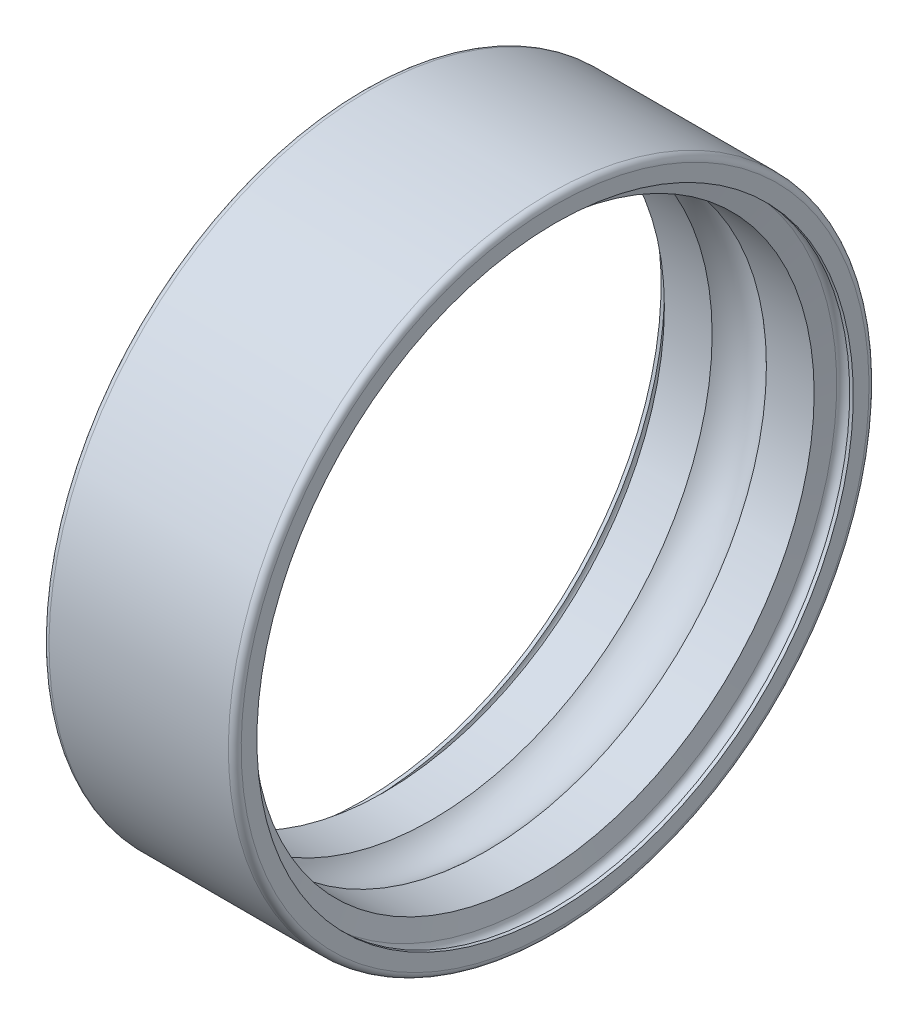
ISO-10303-21;
HEADER;
FILE_DESCRIPTION(('STEP AP214'),'2;1');
FILE_NAME('part.step','',(''),(''),'','','');
FILE_SCHEMA(('AUTOMOTIVE_DESIGN { 1 0 10303 214 1 1 1 1 }'));
ENDSEC;
DATA;
#1=APPLICATION_CONTEXT('core data for automotive mechanical design processes');
#2=APPLICATION_PROTOCOL_DEFINITION('international standard','automotive_design',2000,#1);
#3=PRODUCT_CONTEXT('',#1,'mechanical');
#4=PRODUCT('Part','Part','',(#3));
#5=PRODUCT_RELATED_PRODUCT_CATEGORY('part','',(#4));
#6=PRODUCT_DEFINITION_FORMATION('','',#4);
#7=PRODUCT_DEFINITION_CONTEXT('part definition',#1,'design');
#8=PRODUCT_DEFINITION('design','',#6,#7);
#9=PRODUCT_DEFINITION_SHAPE('','',#8);
#10=(LENGTH_UNIT() NAMED_UNIT(*) SI_UNIT(.MILLI.,.METRE.));
#11=(NAMED_UNIT(*) PLANE_ANGLE_UNIT() SI_UNIT($,.RADIAN.));
#12=(NAMED_UNIT(*) SI_UNIT($,.STERADIAN.) SOLID_ANGLE_UNIT());
#13=UNCERTAINTY_MEASURE_WITH_UNIT(LENGTH_MEASURE(1.E-05),#10,'distance_accuracy_value','');
#14=(GEOMETRIC_REPRESENTATION_CONTEXT(3) GLOBAL_UNCERTAINTY_ASSIGNED_CONTEXT((#13)) GLOBAL_UNIT_ASSIGNED_CONTEXT((#10,
#11,#12)) REPRESENTATION_CONTEXT('',''));
#15=CARTESIAN_POINT('',(0.,0.,0.));
#16=DIRECTION('',(0.,0.,1.));
#17=DIRECTION('',(1.,0.,0.));
#18=AXIS2_PLACEMENT_3D('',#15,#16,#17);
#19=CARTESIAN_POINT('',(2.832,0.,0.));
#20=DIRECTION('',(1.,0.,0.));
#21=DIRECTION('',(0.,0.,-1.));
#22=AXIS2_PLACEMENT_3D('',#19,#20,#21);
#23=TOROIDAL_SURFACE('',#22,4.655,0.112);
#24=CARTESIAN_POINT('',(2.944,0.,0.));
#25=DIRECTION('',(1.,0.,0.));
#26=DIRECTION('',(0.,1.,0.));
#27=AXIS2_PLACEMENT_3D('',#24,#25,#26);
#28=CIRCLE('',#27,4.655);
#29=CARTESIAN_POINT('',(2.944,4.655,0.));
#30=VERTEX_POINT('',#29);
#31=EDGE_CURVE('E11',#30,#30,#28,.T.);
#32=ORIENTED_EDGE('',*,*,#31,.T.);
#33=EDGE_LOOP('',(#32));
#34=FACE_BOUND('',#33,.T.);
#35=CARTESIAN_POINT('',(2.72170153166263,0.,0.));
#36=DIRECTION('',(1.,0.,0.));
#37=DIRECTION('',(0.,1.,0.));
#38=AXIS2_PLACEMENT_3D('',#35,#36,#37);
#39=CIRCLE('',#38,4.6744485958987);
#40=CARTESIAN_POINT('',(2.72170153166263,4.6744485958987,0.));
#41=VERTEX_POINT('',#40);
#42=EDGE_CURVE('E72',#41,#41,#39,.T.);
#43=ORIENTED_EDGE('',*,*,#42,.F.);
#44=EDGE_LOOP('',(#43));
#45=FACE_BOUND('',#44,.T.);
#46=ADVANCED_FACE('F16',(#34,#45),#23,.F.);
#47=CARTESIAN_POINT('',(2.972,0.,0.));
#48=DIRECTION('',(-1.,0.,0.));
#49=DIRECTION('',(0.,1.,0.));
#50=AXIS2_PLACEMENT_3D('',#47,#48,#49);
#51=CYLINDRICAL_SURFACE('',#50,4.655);
#52=CARTESIAN_POINT('',(3.,0.,0.));
#53=DIRECTION('',(1.,0.,0.));
#54=DIRECTION('',(0.,1.,0.));
#55=AXIS2_PLACEMENT_3D('',#52,#53,#54);
#56=CIRCLE('',#55,4.655);
#57=CARTESIAN_POINT('',(3.,4.655,0.));
#58=VERTEX_POINT('',#57);
#59=EDGE_CURVE('E26',#58,#58,#56,.T.);
#60=ORIENTED_EDGE('',*,*,#59,.T.);
#61=EDGE_LOOP('',(#60));
#62=FACE_BOUND('',#61,.T.);
#63=ORIENTED_EDGE('',*,*,#31,.F.);
#64=EDGE_LOOP('',(#63));
#65=FACE_BOUND('',#64,.T.);
#66=ADVANCED_FACE('F124',(#62,#65),#51,.F.);
#67=CARTESIAN_POINT('',(3.,4.7775,0.));
#68=DIRECTION('',(1.,0.,0.));
#69=DIRECTION('',(0.,1.,0.));
#70=AXIS2_PLACEMENT_3D('',#67,#68,#69);
#71=PLANE('',#70);
#72=CARTESIAN_POINT('',(3.,0.,0.));
#73=DIRECTION('',(1.,0.,0.));
#74=DIRECTION('',(0.,1.,0.));
#75=AXIS2_PLACEMENT_3D('',#72,#73,#74);
#76=CIRCLE('',#75,4.9);
#77=CARTESIAN_POINT('',(3.,4.9,0.));
#78=VERTEX_POINT('',#77);
#79=EDGE_CURVE('E62',#78,#78,#76,.T.);
#80=ORIENTED_EDGE('',*,*,#79,.T.);
#81=EDGE_LOOP('',(#80));
#82=FACE_BOUND('',#81,.T.);
#83=ORIENTED_EDGE('',*,*,#59,.F.);
#84=EDGE_LOOP('',(#83));
#85=FACE_BOUND('',#84,.T.);
#86=ADVANCED_FACE('F129',(#82,#85),#71,.T.);
#87=CARTESIAN_POINT('',(2.9,0.,0.));
#88=DIRECTION('',(1.,0.,0.));
#89=DIRECTION('',(0.,0.,-1.));
#90=AXIS2_PLACEMENT_3D('',#87,#88,#89);
#91=TOROIDAL_SURFACE('',#90,4.9,0.1);
#92=CARTESIAN_POINT('',(2.9,0.,0.));
#93=DIRECTION('',(1.,0.,0.));
#94=DIRECTION('',(0.,1.,0.));
#95=AXIS2_PLACEMENT_3D('',#92,#93,#94);
#96=CIRCLE('',#95,5.);
#97=CARTESIAN_POINT('',(2.9,5.,0.));
#98=VERTEX_POINT('',#97);
#99=EDGE_CURVE('E57',#98,#98,#96,.T.);
#100=ORIENTED_EDGE('',*,*,#99,.T.);
#101=EDGE_LOOP('',(#100));
#102=FACE_BOUND('',#101,.T.);
#103=ORIENTED_EDGE('',*,*,#79,.F.);
#104=EDGE_LOOP('',(#103));
#105=FACE_BOUND('',#104,.T.);
#106=ADVANCED_FACE('F140',(#102,#105),#91,.T.);
#107=CARTESIAN_POINT('',(1.5,0.,0.));
#108=DIRECTION('',(-1.,0.,0.));
#109=DIRECTION('',(0.,1.,0.));
#110=AXIS2_PLACEMENT_3D('',#107,#108,#109);
#111=CYLINDRICAL_SURFACE('',#110,5.);
#112=CARTESIAN_POINT('',(0.1,0.,0.));
#113=DIRECTION('',(1.,0.,0.));
#114=DIRECTION('',(0.,1.,0.));
#115=AXIS2_PLACEMENT_3D('',#112,#113,#114);
#116=CIRCLE('',#115,5.);
#117=CARTESIAN_POINT('',(0.1,5.,0.));
#118=VERTEX_POINT('',#117);
#119=EDGE_CURVE('E82',#118,#118,#116,.T.);
#120=ORIENTED_EDGE('',*,*,#119,.T.);
#121=EDGE_LOOP('',(#120));
#122=FACE_BOUND('',#121,.T.);
#123=ORIENTED_EDGE('',*,*,#99,.F.);
#124=EDGE_LOOP('',(#123));
#125=FACE_BOUND('',#124,.T.);
#126=ADVANCED_FACE('F144',(#122,#125),#111,.T.);
#127=CARTESIAN_POINT('',(0.1,0.,0.));
#128=DIRECTION('',(1.,0.,0.));
#129=DIRECTION('',(0.,0.,-1.));
#130=AXIS2_PLACEMENT_3D('',#127,#128,#129);
#131=TOROIDAL_SURFACE('',#130,4.9,0.1);
#132=CARTESIAN_POINT('',(0.,0.,0.));
#133=DIRECTION('',(1.,0.,0.));
#134=DIRECTION('',(0.,1.,0.));
#135=AXIS2_PLACEMENT_3D('',#132,#133,#134);
#136=CIRCLE('',#135,4.9);
#137=CARTESIAN_POINT('',(0.,4.9,0.));
#138=VERTEX_POINT('',#137);
#139=EDGE_CURVE('E87',#138,#138,#136,.T.);
#140=ORIENTED_EDGE('',*,*,#139,.T.);
#141=EDGE_LOOP('',(#140));
#142=FACE_BOUND('',#141,.T.);
#143=ORIENTED_EDGE('',*,*,#119,.F.);
#144=EDGE_LOOP('',(#143));
#145=FACE_BOUND('',#144,.T.);
#146=ADVANCED_FACE('F18',(#142,#145),#131,.T.);
#147=CARTESIAN_POINT('',(0.,4.7775,0.));
#148=DIRECTION('',(-1.,0.,0.));
#149=DIRECTION('',(0.,-1.,0.));
#150=AXIS2_PLACEMENT_3D('',#147,#148,#149);
#151=PLANE('',#150);
#152=CARTESIAN_POINT('',(0.,0.,0.));
#153=DIRECTION('',(1.,0.,0.));
#154=DIRECTION('',(0.,1.,0.));
#155=AXIS2_PLACEMENT_3D('',#152,#153,#154);
#156=CIRCLE('',#155,4.655);
#157=CARTESIAN_POINT('',(0.,4.655,0.));
#158=VERTEX_POINT('',#157);
#159=EDGE_CURVE('E20',#158,#158,#156,.T.);
#160=ORIENTED_EDGE('',*,*,#159,.T.);
#161=EDGE_LOOP('',(#160));
#162=FACE_BOUND('',#161,.T.);
#163=ORIENTED_EDGE('',*,*,#139,.F.);
#164=EDGE_LOOP('',(#163));
#165=FACE_BOUND('',#164,.T.);
#166=ADVANCED_FACE('F134',(#162,#165),#151,.T.);
#167=CARTESIAN_POINT('',(0.028,0.,0.));
#168=DIRECTION('',(-1.,0.,0.));
#169=DIRECTION('',(0.,1.,0.));
#170=AXIS2_PLACEMENT_3D('',#167,#168,#169);
#171=CYLINDRICAL_SURFACE('',#170,4.655);
#172=CARTESIAN_POINT('',(0.056,0.,0.));
#173=DIRECTION('',(1.,0.,0.));
#174=DIRECTION('',(0.,1.,0.));
#175=AXIS2_PLACEMENT_3D('',#172,#173,#174);
#176=CIRCLE('',#175,4.655);
#177=CARTESIAN_POINT('',(0.056,4.655,0.));
#178=VERTEX_POINT('',#177);
#179=EDGE_CURVE('E94',#178,#178,#176,.T.);
#180=ORIENTED_EDGE('',*,*,#179,.T.);
#181=EDGE_LOOP('',(#180));
#182=FACE_BOUND('',#181,.T.);
#183=ORIENTED_EDGE('',*,*,#159,.F.);
#184=EDGE_LOOP('',(#183));
#185=FACE_BOUND('',#184,.T.);
#186=ADVANCED_FACE('F119',(#182,#185),#171,.F.);
#187=CARTESIAN_POINT('',(0.168,0.,0.));
#188=DIRECTION('',(1.,0.,0.));
#189=DIRECTION('',(0.,0.,-1.));
#190=AXIS2_PLACEMENT_3D('',#187,#188,#189);
#191=TOROIDAL_SURFACE('',#190,4.655,0.112);
#192=CARTESIAN_POINT('',(0.278298468337367,0.,0.));
#193=DIRECTION('',(1.,0.,0.));
#194=DIRECTION('',(0.,1.,0.));
#195=AXIS2_PLACEMENT_3D('',#192,#193,#194);
#196=CIRCLE('',#195,4.6744485958987);
#197=CARTESIAN_POINT('',(0.278298468337367,4.6744485958987,0.));
#198=VERTEX_POINT('',#197);
#199=EDGE_CURVE('E86',#198,#198,#196,.T.);
#200=ORIENTED_EDGE('',*,*,#199,.T.);
#201=EDGE_LOOP('',(#200));
#202=FACE_BOUND('',#201,.T.);
#203=ORIENTED_EDGE('',*,*,#179,.F.);
#204=EDGE_LOOP('',(#203));
#205=FACE_BOUND('',#204,.T.);
#206=ADVANCED_FACE('F103',(#202,#205),#191,.F.);
#207=CARTESIAN_POINT('',(0.304698901733471,0.,0.));
#208=DIRECTION('',(-1.,0.,0.));
#209=DIRECTION('',(0.,1.,0.));
#210=AXIS2_PLACEMENT_3D('',#207,#208,#209);
#211=CONICAL_SURFACE('',#210,4.52472429794935,1.39626340159546);
#212=CARTESIAN_POINT('',(0.331099335129574,0.,0.));
#213=DIRECTION('',(1.,0.,0.));
#214=DIRECTION('',(0.,1.,0.));
#215=AXIS2_PLACEMENT_3D('',#212,#213,#214);
#216=CIRCLE('',#215,4.375);
#217=CARTESIAN_POINT('',(0.331099335129574,4.375,0.));
#218=VERTEX_POINT('',#217);
#219=EDGE_CURVE('E83',#218,#218,#216,.T.);
#220=ORIENTED_EDGE('',*,*,#219,.T.);
#221=EDGE_LOOP('',(#220));
#222=FACE_BOUND('',#221,.T.);
#223=ORIENTED_EDGE('',*,*,#199,.F.);
#224=EDGE_LOOP('',(#223));
#225=FACE_BOUND('',#224,.T.);
#226=ADVANCED_FACE('F106',(#222,#225),#211,.F.);
#227=CARTESIAN_POINT('',(0.70378623823857,0.,0.));
#228=DIRECTION('',(-1.,0.,0.));
#229=DIRECTION('',(0.,1.,0.));
#230=AXIS2_PLACEMENT_3D('',#227,#228,#229);
#231=CYLINDRICAL_SURFACE('',#230,4.375);
#232=CARTESIAN_POINT('',(1.07647314134756,0.,0.));
#233=DIRECTION('',(1.,0.,0.));
#234=DIRECTION('',(0.,1.,0.));
#235=AXIS2_PLACEMENT_3D('',#232,#233,#234);
#236=CIRCLE('',#235,4.375);
#237=CARTESIAN_POINT('',(1.07647314134756,4.375,0.));
#238=VERTEX_POINT('',#237);
#239=EDGE_CURVE('E80',#238,#238,#236,.T.);
#240=ORIENTED_EDGE('',*,*,#239,.T.);
#241=EDGE_LOOP('',(#240));
#242=FACE_BOUND('',#241,.T.);
#243=ORIENTED_EDGE('',*,*,#219,.F.);
#244=EDGE_LOOP('',(#243));
#245=FACE_BOUND('',#244,.T.);
#246=ADVANCED_FACE('F108',(#242,#245),#231,.F.);
#247=CARTESIAN_POINT('',(1.5,0.,0.));
#248=DIRECTION('',(1.,0.,0.));
#249=DIRECTION('',(0.,0.,-1.));
#250=AXIS2_PLACEMENT_3D('',#247,#248,#249);
#251=TOROIDAL_SURFACE('',#250,3.95,0.6);
#252=CARTESIAN_POINT('',(1.92352685865244,0.,0.));
#253=DIRECTION('',(1.,0.,0.));
#254=DIRECTION('',(0.,1.,0.));
#255=AXIS2_PLACEMENT_3D('',#252,#253,#254);
#256=CIRCLE('',#255,4.375);
#257=CARTESIAN_POINT('',(1.92352685865244,4.375,0.));
#258=VERTEX_POINT('',#257);
#259=EDGE_CURVE('E74',#258,#258,#256,.T.);
#260=ORIENTED_EDGE('',*,*,#259,.T.);
#261=EDGE_LOOP('',(#260));
#262=FACE_BOUND('',#261,.T.);
#263=ORIENTED_EDGE('',*,*,#239,.F.);
#264=EDGE_LOOP('',(#263));
#265=FACE_BOUND('',#264,.T.);
#266=ADVANCED_FACE('F116',(#262,#265),#251,.F.);
#267=CARTESIAN_POINT('',(2.29621376176143,0.,0.));
#268=DIRECTION('',(-1.,0.,0.));
#269=DIRECTION('',(0.,1.,0.));
#270=AXIS2_PLACEMENT_3D('',#267,#268,#269);
#271=CYLINDRICAL_SURFACE('',#270,4.375);
#272=CARTESIAN_POINT('',(2.66890066487042,0.,0.));
#273=DIRECTION('',(1.,0.,0.));
#274=DIRECTION('',(0.,1.,0.));
#275=AXIS2_PLACEMENT_3D('',#272,#273,#274);
#276=CIRCLE('',#275,4.375);
#277=CARTESIAN_POINT('',(2.66890066487042,4.375,0.));
#278=VERTEX_POINT('',#277);
#279=EDGE_CURVE('E68',#278,#278,#276,.T.);
#280=ORIENTED_EDGE('',*,*,#279,.T.);
#281=EDGE_LOOP('',(#280));
#282=FACE_BOUND('',#281,.T.);
#283=ORIENTED_EDGE('',*,*,#259,.F.);
#284=EDGE_LOOP('',(#283));
#285=FACE_BOUND('',#284,.T.);
#286=ADVANCED_FACE('F69',(#282,#285),#271,.F.);
#287=CARTESIAN_POINT('',(2.69530109826653,0.,0.));
#288=DIRECTION('',(1.,0.,0.));
#289=DIRECTION('',(0.,1.,0.));
#290=AXIS2_PLACEMENT_3D('',#287,#288,#289);
#291=CONICAL_SURFACE('',#290,4.52472429794935,1.39626340159546);
#292=ORIENTED_EDGE('',*,*,#42,.T.);
#293=EDGE_LOOP('',(#292));
#294=FACE_BOUND('',#293,.T.);
#295=ORIENTED_EDGE('',*,*,#279,.F.);
#296=EDGE_LOOP('',(#295));
#297=FACE_BOUND('',#296,.T.);
#298=ADVANCED_FACE('F136',(#294,#297),#291,.F.);
#299=CLOSED_SHELL('',(#46,#66,#86,#106,#126,#146,#166,#186,#206,#226,#246,#266,#286,#298));
#300=MANIFOLD_SOLID_BREP('B1',#299);
#301=ADVANCED_BREP_SHAPE_REPRESENTATION('',(#18,#300),#14);
#302=SHAPE_DEFINITION_REPRESENTATION(#9,#301);
ENDSEC;
END-ISO-10303-21;
